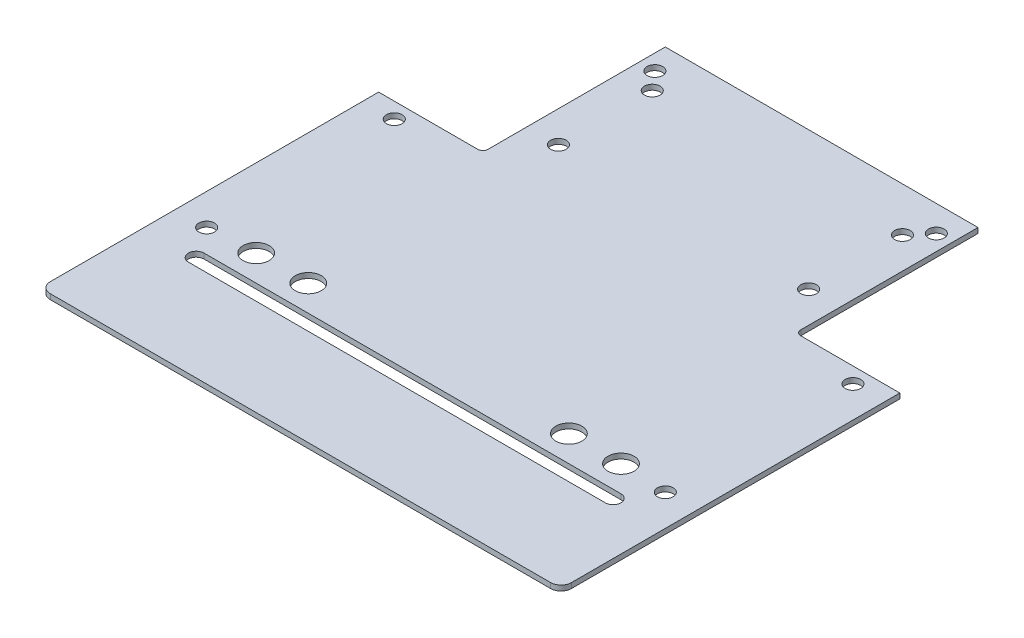
ISO-10303-21;
HEADER;
FILE_DESCRIPTION(('STEP AP214'),'2;1');
FILE_NAME('part.step','',(''),(''),'','','');
FILE_SCHEMA(('AUTOMOTIVE_DESIGN { 1 0 10303 214 1 1 1 1 }'));
ENDSEC;
DATA;
#1=APPLICATION_CONTEXT('core data for automotive mechanical design processes');
#2=APPLICATION_PROTOCOL_DEFINITION('international standard','automotive_design',2000,#1);
#3=PRODUCT_CONTEXT('',#1,'mechanical');
#4=PRODUCT('Part','Part','',(#3));
#5=PRODUCT_RELATED_PRODUCT_CATEGORY('part','',(#4));
#6=PRODUCT_DEFINITION_FORMATION('','',#4);
#7=PRODUCT_DEFINITION_CONTEXT('part definition',#1,'design');
#8=PRODUCT_DEFINITION('design','',#6,#7);
#9=PRODUCT_DEFINITION_SHAPE('','',#8);
#10=(LENGTH_UNIT() NAMED_UNIT(*) SI_UNIT(.MILLI.,.METRE.));
#11=(NAMED_UNIT(*) PLANE_ANGLE_UNIT() SI_UNIT($,.RADIAN.));
#12=(NAMED_UNIT(*) SI_UNIT($,.STERADIAN.) SOLID_ANGLE_UNIT());
#13=UNCERTAINTY_MEASURE_WITH_UNIT(LENGTH_MEASURE(1.E-05),#10,'distance_accuracy_value','');
#14=(GEOMETRIC_REPRESENTATION_CONTEXT(3) GLOBAL_UNCERTAINTY_ASSIGNED_CONTEXT((#13)) GLOBAL_UNIT_ASSIGNED_CONTEXT((#10,
#11,#12)) REPRESENTATION_CONTEXT('',''));
#15=CARTESIAN_POINT('',(0.,0.,0.));
#16=DIRECTION('',(0.,0.,1.));
#17=DIRECTION('',(1.,0.,0.));
#18=AXIS2_PLACEMENT_3D('',#15,#16,#17);
#19=CARTESIAN_POINT('',(2.,1.,-2.));
#20=DIRECTION('',(0.,-1.,0.));
#21=DIRECTION('',(0.,0.,-1.));
#22=AXIS2_PLACEMENT_3D('',#19,#20,#21);
#23=PLANE('',#22);
#24=CARTESIAN_POINT('',(23.,1.,-95.));
#25=DIRECTION('',(0.,1.,0.));
#26=DIRECTION('',(0.,0.,1.));
#27=AXIS2_PLACEMENT_3D('',#24,#25,#26);
#28=CIRCLE('',#27,1.5);
#29=CARTESIAN_POINT('',(23.,1.,-93.5));
#30=VERTEX_POINT('',#29);
#31=EDGE_CURVE('E448',#30,#30,#28,.T.);
#32=ORIENTED_EDGE('',*,*,#31,.F.);
#33=EDGE_LOOP('',(#32));
#34=FACE_BOUND('',#33,.T.);
#35=CARTESIAN_POINT('',(77.,1.,-95.));
#36=DIRECTION('',(0.,1.,0.));
#37=DIRECTION('',(0.,0.,1.));
#38=AXIS2_PLACEMENT_3D('',#35,#36,#37);
#39=CIRCLE('',#38,1.5);
#40=CARTESIAN_POINT('',(77.,1.,-93.5));
#41=VERTEX_POINT('',#40);
#42=EDGE_CURVE('E440',#41,#41,#39,.T.);
#43=ORIENTED_EDGE('',*,*,#42,.F.);
#44=EDGE_LOOP('',(#43));
#45=FACE_BOUND('',#44,.T.);
#46=CARTESIAN_POINT('',(94.,1.,-26.));
#47=DIRECTION('',(0.,1.,0.));
#48=DIRECTION('',(0.,0.,1.));
#49=AXIS2_PLACEMENT_3D('',#46,#47,#48);
#50=CIRCLE('',#49,1.5);
#51=CARTESIAN_POINT('',(94.,1.,-24.5));
#52=VERTEX_POINT('',#51);
#53=EDGE_CURVE('E432',#52,#52,#50,.T.);
#54=ORIENTED_EDGE('',*,*,#53,.F.);
#55=EDGE_LOOP('',(#54));
#56=FACE_BOUND('',#55,.T.);
#57=CARTESIAN_POINT('',(6.,1.,-62.));
#58=DIRECTION('',(0.,1.,0.));
#59=DIRECTION('',(0.,0.,1.));
#60=AXIS2_PLACEMENT_3D('',#57,#58,#59);
#61=CIRCLE('',#60,1.5);
#62=CARTESIAN_POINT('',(6.,1.,-60.5));
#63=VERTEX_POINT('',#62);
#64=EDGE_CURVE('E423',#63,#63,#61,.T.);
#65=ORIENTED_EDGE('',*,*,#64,.F.);
#66=EDGE_LOOP('',(#65));
#67=FACE_BOUND('',#66,.T.);
#68=CARTESIAN_POINT('',(94.,1.,-62.));
#69=DIRECTION('',(0.,1.,0.));
#70=DIRECTION('',(0.,0.,1.));
#71=AXIS2_PLACEMENT_3D('',#68,#69,#70);
#72=CIRCLE('',#71,1.5);
#73=CARTESIAN_POINT('',(94.,1.,-60.5));
#74=VERTEX_POINT('',#73);
#75=EDGE_CURVE('E455',#74,#74,#72,.T.);
#76=ORIENTED_EDGE('',*,*,#75,.F.);
#77=EDGE_LOOP('',(#76));
#78=FACE_BOUND('',#77,.T.);
#79=CARTESIAN_POINT('',(6.00000000000001,1.,-26.));
#80=DIRECTION('',(0.,1.,0.));
#81=DIRECTION('',(0.,0.,1.));
#82=AXIS2_PLACEMENT_3D('',#79,#80,#81);
#83=CIRCLE('',#82,1.5);
#84=CARTESIAN_POINT('',(6.00000000000001,1.,-24.5));
#85=VERTEX_POINT('',#84);
#86=EDGE_CURVE('E415',#85,#85,#83,.T.);
#87=ORIENTED_EDGE('',*,*,#86,.F.);
#88=EDGE_LOOP('',(#87));
#89=FACE_BOUND('',#88,.T.);
#90=CARTESIAN_POINT('',(75.,1.,-26.5));
#91=DIRECTION('',(0.,-1.,0.));
#92=DIRECTION('',(0.,0.,-1.));
#93=AXIS2_PLACEMENT_3D('',#90,#91,#92);
#94=CIRCLE('',#93,2.5);
#95=CARTESIAN_POINT('',(75.,1.,-29.));
#96=VERTEX_POINT('',#95);
#97=EDGE_CURVE('E166',#96,#96,#94,.T.);
#98=ORIENTED_EDGE('',*,*,#97,.T.);
#99=EDGE_LOOP('',(#98));
#100=FACE_BOUND('',#99,.T.);
#101=CARTESIAN_POINT('',(15.,1.,-26.5));
#102=DIRECTION('',(0.,1.,0.));
#103=DIRECTION('',(0.,0.,1.));
#104=AXIS2_PLACEMENT_3D('',#101,#102,#103);
#105=CIRCLE('',#104,2.5);
#106=CARTESIAN_POINT('',(15.,1.,-24.));
#107=VERTEX_POINT('',#106);
#108=EDGE_CURVE('E395',#107,#107,#105,.T.);
#109=ORIENTED_EDGE('',*,*,#108,.F.);
#110=EDGE_LOOP('',(#109));
#111=FACE_BOUND('',#110,.T.);
#112=CARTESIAN_POINT('',(74.,1.,-73.5));
#113=DIRECTION('',(0.,1.,0.));
#114=DIRECTION('',(0.,0.,1.));
#115=AXIS2_PLACEMENT_3D('',#112,#113,#114);
#116=CIRCLE('',#115,1.50000000000001);
#117=CARTESIAN_POINT('',(74.,1.,-72.));
#118=VERTEX_POINT('',#117);
#119=EDGE_CURVE('E207',#118,#118,#116,.T.);
#120=ORIENTED_EDGE('',*,*,#119,.F.);
#121=EDGE_LOOP('',(#120));
#122=FACE_BOUND('',#121,.T.);
#123=CARTESIAN_POINT('',(26.,1.,-73.5));
#124=DIRECTION('',(0.,-1.,0.));
#125=DIRECTION('',(0.,0.,-1.));
#126=AXIS2_PLACEMENT_3D('',#123,#124,#125);
#127=CIRCLE('',#126,1.5);
#128=CARTESIAN_POINT('',(26.,1.,-75.));
#129=VERTEX_POINT('',#128);
#130=EDGE_CURVE('E396',#129,#129,#127,.T.);
#131=ORIENTED_EDGE('',*,*,#130,.T.);
#132=EDGE_LOOP('',(#131));
#133=FACE_BOUND('',#132,.T.);
#134=CARTESIAN_POINT('',(85.,1.,-26.5));
#135=DIRECTION('',(0.,1.,0.));
#136=DIRECTION('',(0.,0.,1.));
#137=AXIS2_PLACEMENT_3D('',#134,#135,#136);
#138=CIRCLE('',#137,2.50000000000001);
#139=CARTESIAN_POINT('',(85.,1.,-24.));
#140=VERTEX_POINT('',#139);
#141=EDGE_CURVE('E247',#140,#140,#138,.F.);
#142=ORIENTED_EDGE('',*,*,#141,.T.);
#143=EDGE_LOOP('',(#142));
#144=FACE_BOUND('',#143,.T.);
#145=CARTESIAN_POINT('',(10.,1.,-20.));
#146=DIRECTION('',(0.,1.,0.));
#147=DIRECTION('',(0.,0.,1.));
#148=AXIS2_PLACEMENT_3D('',#145,#146,#147);
#149=CIRCLE('',#148,1.5);
#150=CARTESIAN_POINT('',(10.,1.,-21.5));
#151=VERTEX_POINT('',#150);
#152=CARTESIAN_POINT('',(10.,1.,-18.5));
#153=VERTEX_POINT('',#152);
#154=EDGE_CURVE('E267',#151,#153,#149,.T.);
#155=ORIENTED_EDGE('',*,*,#154,.F.);
#156=DIRECTION('',(-1.,0.,0.));
#157=VECTOR('',#156,1.);
#158=CARTESIAN_POINT('',(10.,1.,-21.5));
#159=LINE('',#158,#157);
#160=CARTESIAN_POINT('',(90.,1.,-21.5));
#161=VERTEX_POINT('',#160);
#162=EDGE_CURVE('E278',#161,#151,#159,.T.);
#163=ORIENTED_EDGE('',*,*,#162,.F.);
#164=CARTESIAN_POINT('',(90.,1.,-20.));
#165=DIRECTION('',(0.,1.,0.));
#166=DIRECTION('',(0.,0.,1.));
#167=AXIS2_PLACEMENT_3D('',#164,#165,#166);
#168=CIRCLE('',#167,1.5);
#169=CARTESIAN_POINT('',(90.,1.,-18.5));
#170=VERTEX_POINT('',#169);
#171=EDGE_CURVE('E274',#170,#161,#168,.T.);
#172=ORIENTED_EDGE('',*,*,#171,.F.);
#173=DIRECTION('',(1.,0.,0.));
#174=VECTOR('',#173,1.);
#175=CARTESIAN_POINT('',(10.,1.,-18.5));
#176=LINE('',#175,#174);
#177=EDGE_CURVE('E270',#153,#170,#176,.T.);
#178=ORIENTED_EDGE('',*,*,#177,.F.);
#179=EDGE_LOOP('',(#155,#163,#172,#178));
#180=FACE_BOUND('',#179,.T.);
#181=CARTESIAN_POINT('',(74.,1.,-91.5));
#182=DIRECTION('',(0.,1.,0.));
#183=DIRECTION('',(0.,0.,1.));
#184=AXIS2_PLACEMENT_3D('',#181,#182,#183);
#185=CIRCLE('',#184,1.50000000000001);
#186=CARTESIAN_POINT('',(74.,1.,-90.));
#187=VERTEX_POINT('',#186);
#188=EDGE_CURVE('E252',#187,#187,#185,.F.);
#189=ORIENTED_EDGE('',*,*,#188,.T.);
#190=EDGE_LOOP('',(#189));
#191=FACE_BOUND('',#190,.T.);
#192=CARTESIAN_POINT('',(26.,1.,-91.5));
#193=DIRECTION('',(0.,1.,0.));
#194=DIRECTION('',(0.,0.,1.));
#195=AXIS2_PLACEMENT_3D('',#192,#193,#194);
#196=CIRCLE('',#195,1.5);
#197=CARTESIAN_POINT('',(26.,1.,-90.));
#198=VERTEX_POINT('',#197);
#199=EDGE_CURVE('E243',#198,#198,#196,.T.);
#200=ORIENTED_EDGE('',*,*,#199,.F.);
#201=EDGE_LOOP('',(#200));
#202=FACE_BOUND('',#201,.T.);
#203=CARTESIAN_POINT('',(25.,1.,-26.5));
#204=DIRECTION('',(0.,1.,0.));
#205=DIRECTION('',(0.,0.,1.));
#206=AXIS2_PLACEMENT_3D('',#203,#204,#205);
#207=CIRCLE('',#206,2.5);
#208=CARTESIAN_POINT('',(25.,1.,-24.));
#209=VERTEX_POINT('',#208);
#210=EDGE_CURVE('E206',#209,#209,#207,.T.);
#211=ORIENTED_EDGE('',*,*,#210,.F.);
#212=EDGE_LOOP('',(#211));
#213=FACE_BOUND('',#212,.T.);
#214=DIRECTION('',(-1.,0.,0.));
#215=VECTOR('',#214,1.);
#216=CARTESIAN_POINT('',(2.00000000000001,1.,-100.));
#217=LINE('',#216,#215);
#218=CARTESIAN_POINT('',(80.,1.,-100.));
#219=VERTEX_POINT('',#218);
#220=CARTESIAN_POINT('',(20.,1.,-100.));
#221=VERTEX_POINT('',#220);
#222=EDGE_CURVE('E180',#219,#221,#217,.T.);
#223=ORIENTED_EDGE('',*,*,#222,.T.);
#224=DIRECTION('',(0.,0.,-1.));
#225=VECTOR('',#224,1.);
#226=CARTESIAN_POINT('',(20.,1.,0.));
#227=LINE('',#226,#225);
#228=CARTESIAN_POINT('',(20.,1.,-66.));
#229=VERTEX_POINT('',#228);
#230=EDGE_CURVE('E157',#229,#221,#227,.T.);
#231=ORIENTED_EDGE('',*,*,#230,.F.);
#232=CARTESIAN_POINT('',(19.,1.,-66.));
#233=DIRECTION('',(0.,1.,0.));
#234=DIRECTION('',(0.,0.,1.));
#235=AXIS2_PLACEMENT_3D('',#232,#233,#234);
#236=CIRCLE('',#235,1.);
#237=CARTESIAN_POINT('',(19.,1.,-65.));
#238=VERTEX_POINT('',#237);
#239=EDGE_CURVE('E169',#238,#229,#236,.T.);
#240=ORIENTED_EDGE('',*,*,#239,.F.);
#241=DIRECTION('',(1.,0.,0.));
#242=VECTOR('',#241,1.);
#243=CARTESIAN_POINT('',(0.,1.,-65.));
#244=LINE('',#243,#242);
#245=CARTESIAN_POINT('',(0.,1.,-65.));
#246=VERTEX_POINT('',#245);
#247=EDGE_CURVE('E175',#246,#238,#244,.T.);
#248=ORIENTED_EDGE('',*,*,#247,.F.);
#249=DIRECTION('',(0.,0.,1.));
#250=VECTOR('',#249,1.);
#251=CARTESIAN_POINT('',(0.,1.,-2.00000000000001));
#252=LINE('',#251,#250);
#253=CARTESIAN_POINT('',(0.,1.,-2.00000000000001));
#254=VERTEX_POINT('',#253);
#255=EDGE_CURVE('E327',#246,#254,#252,.T.);
#256=ORIENTED_EDGE('',*,*,#255,.T.);
#257=CARTESIAN_POINT('',(2.,1.,-2.));
#258=DIRECTION('',(0.,1.,0.));
#259=DIRECTION('',(0.,0.,-1.));
#260=AXIS2_PLACEMENT_3D('',#257,#258,#259);
#261=CIRCLE('',#260,2.);
#262=CARTESIAN_POINT('',(2.00000000000001,1.,0.));
#263=VERTEX_POINT('',#262);
#264=EDGE_CURVE('E310',#254,#263,#261,.T.);
#265=ORIENTED_EDGE('',*,*,#264,.T.);
#266=DIRECTION('',(1.,0.,0.));
#267=VECTOR('',#266,1.);
#268=CARTESIAN_POINT('',(2.00000000000001,1.,0.));
#269=LINE('',#268,#267);
#270=CARTESIAN_POINT('',(98.,1.,0.));
#271=VERTEX_POINT('',#270);
#272=EDGE_CURVE('E314',#263,#271,#269,.T.);
#273=ORIENTED_EDGE('',*,*,#272,.T.);
#274=CARTESIAN_POINT('',(98.,1.,-2.));
#275=DIRECTION('',(0.,1.,0.));
#276=DIRECTION('',(0.,0.,1.));
#277=AXIS2_PLACEMENT_3D('',#274,#275,#276);
#278=CIRCLE('',#277,2.);
#279=CARTESIAN_POINT('',(100.,1.,-2.00000000000001));
#280=VERTEX_POINT('',#279);
#281=EDGE_CURVE('E318',#271,#280,#278,.T.);
#282=ORIENTED_EDGE('',*,*,#281,.T.);
#283=DIRECTION('',(0.,0.,-1.));
#284=VECTOR('',#283,1.);
#285=CARTESIAN_POINT('',(100.,1.,-2.00000000000001));
#286=LINE('',#285,#284);
#287=CARTESIAN_POINT('',(100.,1.,-65.));
#288=VERTEX_POINT('',#287);
#289=EDGE_CURVE('E321',#280,#288,#286,.T.);
#290=ORIENTED_EDGE('',*,*,#289,.T.);
#291=DIRECTION('',(-1.,0.,0.));
#292=VECTOR('',#291,1.);
#293=CARTESIAN_POINT('',(0.,1.,-65.));
#294=LINE('',#293,#292);
#295=CARTESIAN_POINT('',(81.,1.,-65.));
#296=VERTEX_POINT('',#295);
#297=EDGE_CURVE('E226',#288,#296,#294,.T.);
#298=ORIENTED_EDGE('',*,*,#297,.T.);
#299=CARTESIAN_POINT('',(81.,1.,-66.));
#300=DIRECTION('',(0.,1.,0.));
#301=DIRECTION('',(0.,0.,1.));
#302=AXIS2_PLACEMENT_3D('',#299,#300,#301);
#303=CIRCLE('',#302,1.);
#304=CARTESIAN_POINT('',(80.,1.,-66.));
#305=VERTEX_POINT('',#304);
#306=EDGE_CURVE('E230',#296,#305,#303,.F.);
#307=ORIENTED_EDGE('',*,*,#306,.T.);
#308=DIRECTION('',(0.,0.,-1.));
#309=VECTOR('',#308,1.);
#310=CARTESIAN_POINT('',(80.,1.,0.));
#311=LINE('',#310,#309);
#312=EDGE_CURVE('E216',#305,#219,#311,.T.);
#313=ORIENTED_EDGE('',*,*,#312,.T.);
#314=EDGE_LOOP('',(#223,#231,#240,#248,#256,#265,#273,#282,#290,#298,#307,#313));
#315=FACE_BOUND('',#314,.T.);
#316=ADVANCED_FACE('F39',(#34,#45,#56,#67,#78,#89,#100,#111,#122,#133,#144,#180,#191,#202,#213,
#315),#23,.F.);
#317=CARTESIAN_POINT('',(2.,0.,-2.));
#318=DIRECTION('',(0.,-1.,0.));
#319=DIRECTION('',(0.,0.,-1.));
#320=AXIS2_PLACEMENT_3D('',#317,#318,#319);
#321=PLANE('',#320);
#322=CARTESIAN_POINT('',(23.,0.,-95.));
#323=DIRECTION('',(0.,1.,0.));
#324=DIRECTION('',(0.,0.,1.));
#325=AXIS2_PLACEMENT_3D('',#322,#323,#324);
#326=CIRCLE('',#325,1.5);
#327=CARTESIAN_POINT('',(23.,0.,-93.5));
#328=VERTEX_POINT('',#327);
#329=EDGE_CURVE('E419',#328,#328,#326,.T.);
#330=ORIENTED_EDGE('',*,*,#329,.T.);
#331=EDGE_LOOP('',(#330));
#332=FACE_BOUND('',#331,.T.);
#333=CARTESIAN_POINT('',(77.,0.,-95.));
#334=DIRECTION('',(0.,1.,0.));
#335=DIRECTION('',(0.,0.,1.));
#336=AXIS2_PLACEMENT_3D('',#333,#334,#335);
#337=CIRCLE('',#336,1.5);
#338=CARTESIAN_POINT('',(77.,0.,-93.5));
#339=VERTEX_POINT('',#338);
#340=EDGE_CURVE('E444',#339,#339,#337,.T.);
#341=ORIENTED_EDGE('',*,*,#340,.T.);
#342=EDGE_LOOP('',(#341));
#343=FACE_BOUND('',#342,.T.);
#344=CARTESIAN_POINT('',(94.,0.,-26.));
#345=DIRECTION('',(0.,1.,0.));
#346=DIRECTION('',(0.,0.,1.));
#347=AXIS2_PLACEMENT_3D('',#344,#345,#346);
#348=CIRCLE('',#347,1.5);
#349=CARTESIAN_POINT('',(94.,0.,-24.5));
#350=VERTEX_POINT('',#349);
#351=EDGE_CURVE('E436',#350,#350,#348,.T.);
#352=ORIENTED_EDGE('',*,*,#351,.T.);
#353=EDGE_LOOP('',(#352));
#354=FACE_BOUND('',#353,.T.);
#355=CARTESIAN_POINT('',(6.,0.,-62.));
#356=DIRECTION('',(0.,1.,0.));
#357=DIRECTION('',(0.,0.,1.));
#358=AXIS2_PLACEMENT_3D('',#355,#356,#357);
#359=CIRCLE('',#358,1.5);
#360=CARTESIAN_POINT('',(6.,0.,-60.5));
#361=VERTEX_POINT('',#360);
#362=EDGE_CURVE('E427',#361,#361,#359,.T.);
#363=ORIENTED_EDGE('',*,*,#362,.T.);
#364=EDGE_LOOP('',(#363));
#365=FACE_BOUND('',#364,.T.);
#366=CARTESIAN_POINT('',(94.,0.,-62.));
#367=DIRECTION('',(0.,1.,0.));
#368=DIRECTION('',(0.,0.,1.));
#369=AXIS2_PLACEMENT_3D('',#366,#367,#368);
#370=CIRCLE('',#369,1.5);
#371=CARTESIAN_POINT('',(94.,0.,-60.5));
#372=VERTEX_POINT('',#371);
#373=EDGE_CURVE('E428',#372,#372,#370,.T.);
#374=ORIENTED_EDGE('',*,*,#373,.T.);
#375=EDGE_LOOP('',(#374));
#376=FACE_BOUND('',#375,.T.);
#377=CARTESIAN_POINT('',(6.00000000000001,0.,-26.));
#378=DIRECTION('',(0.,1.,0.));
#379=DIRECTION('',(0.,0.,1.));
#380=AXIS2_PLACEMENT_3D('',#377,#378,#379);
#381=CIRCLE('',#380,1.5);
#382=CARTESIAN_POINT('',(6.00000000000001,0.,-24.5));
#383=VERTEX_POINT('',#382);
#384=EDGE_CURVE('E411',#383,#383,#381,.T.);
#385=ORIENTED_EDGE('',*,*,#384,.T.);
#386=EDGE_LOOP('',(#385));
#387=FACE_BOUND('',#386,.T.);
#388=CARTESIAN_POINT('',(25.,0.,-26.5));
#389=DIRECTION('',(0.,1.,0.));
#390=DIRECTION('',(0.,0.,1.));
#391=AXIS2_PLACEMENT_3D('',#388,#389,#390);
#392=CIRCLE('',#391,2.5);
#393=CARTESIAN_POINT('',(25.,0.,-24.));
#394=VERTEX_POINT('',#393);
#395=EDGE_CURVE('E400',#394,#394,#392,.T.);
#396=ORIENTED_EDGE('',*,*,#395,.T.);
#397=EDGE_LOOP('',(#396));
#398=FACE_BOUND('',#397,.T.);
#399=CARTESIAN_POINT('',(15.,0.,-26.5));
#400=DIRECTION('',(0.,1.,0.));
#401=DIRECTION('',(0.,0.,1.));
#402=AXIS2_PLACEMENT_3D('',#399,#400,#401);
#403=CIRCLE('',#402,2.5);
#404=CARTESIAN_POINT('',(15.,0.,-24.));
#405=VERTEX_POINT('',#404);
#406=EDGE_CURVE('E391',#405,#405,#403,.T.);
#407=ORIENTED_EDGE('',*,*,#406,.T.);
#408=EDGE_LOOP('',(#407));
#409=FACE_BOUND('',#408,.T.);
#410=CARTESIAN_POINT('',(26.,0.,-91.5));
#411=DIRECTION('',(0.,1.,0.));
#412=DIRECTION('',(0.,0.,1.));
#413=AXIS2_PLACEMENT_3D('',#410,#411,#412);
#414=CIRCLE('',#413,1.5);
#415=CARTESIAN_POINT('',(26.,0.,-90.));
#416=VERTEX_POINT('',#415);
#417=EDGE_CURVE('E248',#416,#416,#414,.T.);
#418=ORIENTED_EDGE('',*,*,#417,.T.);
#419=EDGE_LOOP('',(#418));
#420=FACE_BOUND('',#419,.T.);
#421=CARTESIAN_POINT('',(74.,0.,-73.5));
#422=DIRECTION('',(0.,1.,0.));
#423=DIRECTION('',(0.,0.,1.));
#424=AXIS2_PLACEMENT_3D('',#421,#422,#423);
#425=CIRCLE('',#424,1.50000000000001);
#426=CARTESIAN_POINT('',(74.,0.,-72.));
#427=VERTEX_POINT('',#426);
#428=EDGE_CURVE('E212',#427,#427,#425,.T.);
#429=ORIENTED_EDGE('',*,*,#428,.T.);
#430=EDGE_LOOP('',(#429));
#431=FACE_BOUND('',#430,.T.);
#432=DIRECTION('',(-1.,0.,0.));
#433=VECTOR('',#432,1.);
#434=CARTESIAN_POINT('',(10.,0.,-21.5));
#435=LINE('',#434,#433);
#436=CARTESIAN_POINT('',(90.,0.,-21.5));
#437=VERTEX_POINT('',#436);
#438=CARTESIAN_POINT('',(10.,0.,-21.5));
#439=VERTEX_POINT('',#438);
#440=EDGE_CURVE('E271',#437,#439,#435,.T.);
#441=ORIENTED_EDGE('',*,*,#440,.T.);
#442=CARTESIAN_POINT('',(10.,0.,-20.));
#443=DIRECTION('',(0.,1.,0.));
#444=DIRECTION('',(0.,0.,1.));
#445=AXIS2_PLACEMENT_3D('',#442,#443,#444);
#446=CIRCLE('',#445,1.5);
#447=CARTESIAN_POINT('',(10.,0.,-18.5));
#448=VERTEX_POINT('',#447);
#449=EDGE_CURVE('E263',#439,#448,#446,.T.);
#450=ORIENTED_EDGE('',*,*,#449,.T.);
#451=DIRECTION('',(1.,0.,0.));
#452=VECTOR('',#451,1.);
#453=CARTESIAN_POINT('',(10.,0.,-18.5));
#454=LINE('',#453,#452);
#455=CARTESIAN_POINT('',(90.,0.,-18.5));
#456=VERTEX_POINT('',#455);
#457=EDGE_CURVE('E285',#448,#456,#454,.T.);
#458=ORIENTED_EDGE('',*,*,#457,.T.);
#459=CARTESIAN_POINT('',(90.,0.,-20.));
#460=DIRECTION('',(0.,1.,0.));
#461=DIRECTION('',(0.,0.,1.));
#462=AXIS2_PLACEMENT_3D('',#459,#460,#461);
#463=CIRCLE('',#462,1.5);
#464=EDGE_CURVE('E289',#456,#437,#463,.T.);
#465=ORIENTED_EDGE('',*,*,#464,.T.);
#466=EDGE_LOOP('',(#441,#450,#458,#465));
#467=FACE_BOUND('',#466,.T.);
#468=CARTESIAN_POINT('',(85.,0.,-26.5));
#469=DIRECTION('',(0.,1.,0.));
#470=DIRECTION('',(0.,0.,1.));
#471=AXIS2_PLACEMENT_3D('',#468,#469,#470);
#472=CIRCLE('',#471,2.50000000000001);
#473=CARTESIAN_POINT('',(85.,0.,-24.));
#474=VERTEX_POINT('',#473);
#475=EDGE_CURVE('E259',#474,#474,#472,.F.);
#476=ORIENTED_EDGE('',*,*,#475,.F.);
#477=EDGE_LOOP('',(#476));
#478=FACE_BOUND('',#477,.T.);
#479=CARTESIAN_POINT('',(26.,0.,-73.5));
#480=DIRECTION('',(0.,-1.,0.));
#481=DIRECTION('',(0.,0.,-1.));
#482=AXIS2_PLACEMENT_3D('',#479,#480,#481);
#483=CIRCLE('',#482,1.5);
#484=CARTESIAN_POINT('',(26.,0.,-75.));
#485=VERTEX_POINT('',#484);
#486=EDGE_CURVE('E407',#485,#485,#483,.T.);
#487=ORIENTED_EDGE('',*,*,#486,.F.);
#488=EDGE_LOOP('',(#487));
#489=FACE_BOUND('',#488,.T.);
#490=CARTESIAN_POINT('',(74.,0.,-91.5));
#491=DIRECTION('',(0.,1.,0.));
#492=DIRECTION('',(0.,0.,1.));
#493=AXIS2_PLACEMENT_3D('',#490,#491,#492);
#494=CIRCLE('',#493,1.50000000000001);
#495=CARTESIAN_POINT('',(74.,0.,-90.));
#496=VERTEX_POINT('',#495);
#497=EDGE_CURVE('E211',#496,#496,#494,.F.);
#498=ORIENTED_EDGE('',*,*,#497,.F.);
#499=EDGE_LOOP('',(#498));
#500=FACE_BOUND('',#499,.T.);
#501=CARTESIAN_POINT('',(75.,0.,-26.5));
#502=DIRECTION('',(0.,-1.,0.));
#503=DIRECTION('',(0.,0.,-1.));
#504=AXIS2_PLACEMENT_3D('',#501,#502,#503);
#505=CIRCLE('',#504,2.5);
#506=CARTESIAN_POINT('',(75.,0.,-29.));
#507=VERTEX_POINT('',#506);
#508=EDGE_CURVE('E202',#507,#507,#505,.T.);
#509=ORIENTED_EDGE('',*,*,#508,.F.);
#510=EDGE_LOOP('',(#509));
#511=FACE_BOUND('',#510,.T.);
#512=DIRECTION('',(0.,0.,-1.));
#513=VECTOR('',#512,1.);
#514=CARTESIAN_POINT('',(20.,0.,0.));
#515=LINE('',#514,#513);
#516=CARTESIAN_POINT('',(20.,0.,-66.));
#517=VERTEX_POINT('',#516);
#518=CARTESIAN_POINT('',(20.,0.,-100.));
#519=VERTEX_POINT('',#518);
#520=EDGE_CURVE('E160',#517,#519,#515,.T.);
#521=ORIENTED_EDGE('',*,*,#520,.T.);
#522=DIRECTION('',(-1.,0.,0.));
#523=VECTOR('',#522,1.);
#524=CARTESIAN_POINT('',(2.00000000000001,0.,-100.));
#525=LINE('',#524,#523);
#526=CARTESIAN_POINT('',(80.,0.,-100.));
#527=VERTEX_POINT('',#526);
#528=EDGE_CURVE('E344',#527,#519,#525,.T.);
#529=ORIENTED_EDGE('',*,*,#528,.F.);
#530=DIRECTION('',(0.,0.,-1.));
#531=VECTOR('',#530,1.);
#532=CARTESIAN_POINT('',(80.,0.,0.));
#533=LINE('',#532,#531);
#534=CARTESIAN_POINT('',(80.,0.,-66.));
#535=VERTEX_POINT('',#534);
#536=EDGE_CURVE('E55',#535,#527,#533,.T.);
#537=ORIENTED_EDGE('',*,*,#536,.F.);
#538=CARTESIAN_POINT('',(81.,0.,-66.));
#539=DIRECTION('',(0.,1.,0.));
#540=DIRECTION('',(0.,0.,1.));
#541=AXIS2_PLACEMENT_3D('',#538,#539,#540);
#542=CIRCLE('',#541,1.);
#543=CARTESIAN_POINT('',(81.,0.,-65.));
#544=VERTEX_POINT('',#543);
#545=EDGE_CURVE('E238',#544,#535,#542,.F.);
#546=ORIENTED_EDGE('',*,*,#545,.F.);
#547=DIRECTION('',(-1.,0.,0.));
#548=VECTOR('',#547,1.);
#549=CARTESIAN_POINT('',(0.,0.,-65.));
#550=LINE('',#549,#548);
#551=CARTESIAN_POINT('',(100.,0.,-65.));
#552=VERTEX_POINT('',#551);
#553=EDGE_CURVE('E220',#552,#544,#550,.T.);
#554=ORIENTED_EDGE('',*,*,#553,.F.);
#555=DIRECTION('',(0.,0.,-1.));
#556=VECTOR('',#555,1.);
#557=CARTESIAN_POINT('',(100.,0.,-2.00000000000001));
#558=LINE('',#557,#556);
#559=CARTESIAN_POINT('',(100.,0.,-2.00000000000001));
#560=VERTEX_POINT('',#559);
#561=EDGE_CURVE('E340',#560,#552,#558,.T.);
#562=ORIENTED_EDGE('',*,*,#561,.F.);
#563=CARTESIAN_POINT('',(98.,0.,-2.));
#564=DIRECTION('',(0.,1.,0.));
#565=DIRECTION('',(0.,0.,1.));
#566=AXIS2_PLACEMENT_3D('',#563,#564,#565);
#567=CIRCLE('',#566,2.);
#568=CARTESIAN_POINT('',(98.,0.,0.));
#569=VERTEX_POINT('',#568);
#570=EDGE_CURVE('E337',#569,#560,#567,.T.);
#571=ORIENTED_EDGE('',*,*,#570,.F.);
#572=DIRECTION('',(1.,0.,0.));
#573=VECTOR('',#572,1.);
#574=CARTESIAN_POINT('',(2.00000000000001,0.,0.));
#575=LINE('',#574,#573);
#576=CARTESIAN_POINT('',(2.00000000000001,0.,0.));
#577=VERTEX_POINT('',#576);
#578=EDGE_CURVE('E334',#577,#569,#575,.T.);
#579=ORIENTED_EDGE('',*,*,#578,.F.);
#580=CARTESIAN_POINT('',(2.,0.,-2.));
#581=DIRECTION('',(0.,1.,0.));
#582=DIRECTION('',(0.,0.,-1.));
#583=AXIS2_PLACEMENT_3D('',#580,#581,#582);
#584=CIRCLE('',#583,2.);
#585=CARTESIAN_POINT('',(0.,0.,-2.00000000000001));
#586=VERTEX_POINT('',#585);
#587=EDGE_CURVE('E309',#586,#577,#584,.T.);
#588=ORIENTED_EDGE('',*,*,#587,.F.);
#589=DIRECTION('',(0.,0.,1.));
#590=VECTOR('',#589,1.);
#591=CARTESIAN_POINT('',(0.,0.,-2.00000000000001));
#592=LINE('',#591,#590);
#593=CARTESIAN_POINT('',(0.,0.,-65.));
#594=VERTEX_POINT('',#593);
#595=EDGE_CURVE('E315',#594,#586,#592,.T.);
#596=ORIENTED_EDGE('',*,*,#595,.F.);
#597=DIRECTION('',(1.,0.,0.));
#598=VECTOR('',#597,1.);
#599=CARTESIAN_POINT('',(0.,0.,-65.));
#600=LINE('',#599,#598);
#601=CARTESIAN_POINT('',(19.,0.,-65.));
#602=VERTEX_POINT('',#601);
#603=EDGE_CURVE('E63',#594,#602,#600,.T.);
#604=ORIENTED_EDGE('',*,*,#603,.T.);
#605=CARTESIAN_POINT('',(19.,0.,-66.));
#606=DIRECTION('',(0.,1.,0.));
#607=DIRECTION('',(0.,0.,1.));
#608=AXIS2_PLACEMENT_3D('',#605,#606,#607);
#609=CIRCLE('',#608,1.);
#610=EDGE_CURVE('E191',#602,#517,#609,.T.);
#611=ORIENTED_EDGE('',*,*,#610,.T.);
#612=EDGE_LOOP('',(#521,#529,#537,#546,#554,#562,#571,#579,#588,#596,#604,#611));
#613=FACE_BOUND('',#612,.T.);
#614=ADVANCED_FACE('F367',(#332,#343,#354,#365,#376,#387,#398,#409,#420,#431,#467,#478,#489,
#500,#511,#613),#321,.T.);
#615=CARTESIAN_POINT('',(100.,1.,-2.00000000000001));
#616=DIRECTION('',(-1.,0.,0.));
#617=DIRECTION('',(0.,0.,1.));
#618=AXIS2_PLACEMENT_3D('',#615,#616,#617);
#619=PLANE('',#618);
#620=DIRECTION('',(0.,1.,0.));
#621=VECTOR('',#620,1.);
#622=CARTESIAN_POINT('',(100.,0.,-65.));
#623=LINE('',#622,#621);
#624=EDGE_CURVE('E182',#552,#288,#623,.T.);
#625=ORIENTED_EDGE('',*,*,#624,.T.);
#626=ORIENTED_EDGE('',*,*,#289,.F.);
#627=DIRECTION('',(0.,-1.,0.));
#628=VECTOR('',#627,1.);
#629=CARTESIAN_POINT('',(100.,1.,-2.00000000000001));
#630=LINE('',#629,#628);
#631=EDGE_CURVE('E353',#280,#560,#630,.T.);
#632=ORIENTED_EDGE('',*,*,#631,.T.);
#633=ORIENTED_EDGE('',*,*,#561,.T.);
#634=EDGE_LOOP('',(#625,#626,#632,#633));
#635=FACE_BOUND('',#634,.T.);
#636=ADVANCED_FACE('F372',(#635),#619,.F.);
#637=CARTESIAN_POINT('',(2.00000000000001,1.,-100.));
#638=DIRECTION('',(0.,0.,1.));
#639=DIRECTION('',(1.,0.,0.));
#640=AXIS2_PLACEMENT_3D('',#637,#638,#639);
#641=PLANE('',#640);
#642=ORIENTED_EDGE('',*,*,#528,.T.);
#643=DIRECTION('',(0.,1.,0.));
#644=VECTOR('',#643,1.);
#645=CARTESIAN_POINT('',(20.,0.,-100.));
#646=LINE('',#645,#644);
#647=EDGE_CURVE('E194',#519,#221,#646,.T.);
#648=ORIENTED_EDGE('',*,*,#647,.T.);
#649=ORIENTED_EDGE('',*,*,#222,.F.);
#650=DIRECTION('',(0.,1.,0.));
#651=VECTOR('',#650,1.);
#652=CARTESIAN_POINT('',(80.,0.,-100.));
#653=LINE('',#652,#651);
#654=EDGE_CURVE('E217',#527,#219,#653,.T.);
#655=ORIENTED_EDGE('',*,*,#654,.F.);
#656=EDGE_LOOP('',(#642,#648,#649,#655));
#657=FACE_BOUND('',#656,.T.);
#658=ADVANCED_FACE('F573',(#657),#641,.F.);
#659=CARTESIAN_POINT('',(2.,1.,-2.));
#660=DIRECTION('',(0.,-1.,0.));
#661=DIRECTION('',(0.,0.,-1.));
#662=AXIS2_PLACEMENT_3D('',#659,#660,#661);
#663=CYLINDRICAL_SURFACE('',#662,2.);
#664=ORIENTED_EDGE('',*,*,#587,.T.);
#665=DIRECTION('',(0.,-1.,0.));
#666=VECTOR('',#665,1.);
#667=CARTESIAN_POINT('',(2.00000000000001,1.,0.));
#668=LINE('',#667,#666);
#669=EDGE_CURVE('E11',#263,#577,#668,.T.);
#670=ORIENTED_EDGE('',*,*,#669,.F.);
#671=ORIENTED_EDGE('',*,*,#264,.F.);
#672=DIRECTION('',(0.,-1.,0.));
#673=VECTOR('',#672,1.);
#674=CARTESIAN_POINT('',(0.,1.,-2.00000000000001));
#675=LINE('',#674,#673);
#676=EDGE_CURVE('E330',#254,#586,#675,.T.);
#677=ORIENTED_EDGE('',*,*,#676,.T.);
#678=EDGE_LOOP('',(#664,#670,#671,#677));
#679=FACE_BOUND('',#678,.T.);
#680=ADVANCED_FACE('F41',(#679),#663,.T.);
#681=CARTESIAN_POINT('',(2.00000000000001,1.,0.));
#682=DIRECTION('',(0.,0.,-1.));
#683=DIRECTION('',(-1.,0.,0.));
#684=AXIS2_PLACEMENT_3D('',#681,#682,#683);
#685=PLANE('',#684);
#686=ORIENTED_EDGE('',*,*,#578,.T.);
#687=DIRECTION('',(0.,-1.,0.));
#688=VECTOR('',#687,1.);
#689=CARTESIAN_POINT('',(98.,1.,0.));
#690=LINE('',#689,#688);
#691=EDGE_CURVE('E48',#271,#569,#690,.T.);
#692=ORIENTED_EDGE('',*,*,#691,.F.);
#693=ORIENTED_EDGE('',*,*,#272,.F.);
#694=ORIENTED_EDGE('',*,*,#669,.T.);
#695=EDGE_LOOP('',(#686,#692,#693,#694));
#696=FACE_BOUND('',#695,.T.);
#697=ADVANCED_FACE('F376',(#696),#685,.F.);
#698=CARTESIAN_POINT('',(98.,1.,-2.));
#699=DIRECTION('',(0.,-1.,0.));
#700=DIRECTION('',(0.,0.,-1.));
#701=AXIS2_PLACEMENT_3D('',#698,#699,#700);
#702=CYLINDRICAL_SURFACE('',#701,2.);
#703=ORIENTED_EDGE('',*,*,#570,.T.);
#704=ORIENTED_EDGE('',*,*,#631,.F.);
#705=ORIENTED_EDGE('',*,*,#281,.F.);
#706=ORIENTED_EDGE('',*,*,#691,.T.);
#707=EDGE_LOOP('',(#703,#704,#705,#706));
#708=FACE_BOUND('',#707,.T.);
#709=ADVANCED_FACE('F362',(#708),#702,.T.);
#710=CARTESIAN_POINT('',(0.,1.,-2.00000000000001));
#711=DIRECTION('',(1.,0.,0.));
#712=DIRECTION('',(0.,0.,-1.));
#713=AXIS2_PLACEMENT_3D('',#710,#711,#712);
#714=PLANE('',#713);
#715=ORIENTED_EDGE('',*,*,#255,.F.);
#716=DIRECTION('',(0.,1.,0.));
#717=VECTOR('',#716,1.);
#718=CARTESIAN_POINT('',(0.,0.,-65.));
#719=LINE('',#718,#717);
#720=EDGE_CURVE('E383',#594,#246,#719,.T.);
#721=ORIENTED_EDGE('',*,*,#720,.F.);
#722=ORIENTED_EDGE('',*,*,#595,.T.);
#723=ORIENTED_EDGE('',*,*,#676,.F.);
#724=EDGE_LOOP('',(#715,#721,#722,#723));
#725=FACE_BOUND('',#724,.T.);
#726=ADVANCED_FACE('F382',(#725),#714,.F.);
#727=CARTESIAN_POINT('',(10.,1.,-20.));
#728=DIRECTION('',(0.,-1.,0.));
#729=DIRECTION('',(0.,0.,-1.));
#730=AXIS2_PLACEMENT_3D('',#727,#728,#729);
#731=CYLINDRICAL_SURFACE('',#730,1.5);
#732=ORIENTED_EDGE('',*,*,#449,.F.);
#733=DIRECTION('',(0.,-1.,0.));
#734=VECTOR('',#733,1.);
#735=CARTESIAN_POINT('',(10.,1.,-21.5));
#736=LINE('',#735,#734);
#737=EDGE_CURVE('E281',#151,#439,#736,.T.);
#738=ORIENTED_EDGE('',*,*,#737,.F.);
#739=ORIENTED_EDGE('',*,*,#154,.T.);
#740=DIRECTION('',(0.,-1.,0.));
#741=VECTOR('',#740,1.);
#742=CARTESIAN_POINT('',(10.,1.,-18.5));
#743=LINE('',#742,#741);
#744=EDGE_CURVE('E305',#153,#448,#743,.T.);
#745=ORIENTED_EDGE('',*,*,#744,.T.);
#746=EDGE_LOOP('',(#732,#738,#739,#745));
#747=FACE_BOUND('',#746,.T.);
#748=ADVANCED_FACE('F563',(#747),#731,.F.);
#749=CARTESIAN_POINT('',(10.,1.,-18.5));
#750=DIRECTION('',(0.,0.,-1.));
#751=DIRECTION('',(-1.,0.,0.));
#752=AXIS2_PLACEMENT_3D('',#749,#750,#751);
#753=PLANE('',#752);
#754=ORIENTED_EDGE('',*,*,#457,.F.);
#755=ORIENTED_EDGE('',*,*,#744,.F.);
#756=ORIENTED_EDGE('',*,*,#177,.T.);
#757=DIRECTION('',(0.,-1.,0.));
#758=VECTOR('',#757,1.);
#759=CARTESIAN_POINT('',(90.,1.,-18.5));
#760=LINE('',#759,#758);
#761=EDGE_CURVE('E302',#170,#456,#760,.T.);
#762=ORIENTED_EDGE('',*,*,#761,.T.);
#763=EDGE_LOOP('',(#754,#755,#756,#762));
#764=FACE_BOUND('',#763,.T.);
#765=ADVANCED_FACE('F559',(#764),#753,.T.);
#766=CARTESIAN_POINT('',(90.,1.,-20.));
#767=DIRECTION('',(0.,-1.,0.));
#768=DIRECTION('',(0.,0.,-1.));
#769=AXIS2_PLACEMENT_3D('',#766,#767,#768);
#770=CYLINDRICAL_SURFACE('',#769,1.5);
#771=ORIENTED_EDGE('',*,*,#464,.F.);
#772=ORIENTED_EDGE('',*,*,#761,.F.);
#773=ORIENTED_EDGE('',*,*,#171,.T.);
#774=DIRECTION('',(0.,-1.,0.));
#775=VECTOR('',#774,1.);
#776=CARTESIAN_POINT('',(90.,1.,-21.5));
#777=LINE('',#776,#775);
#778=EDGE_CURVE('E299',#161,#437,#777,.T.);
#779=ORIENTED_EDGE('',*,*,#778,.T.);
#780=EDGE_LOOP('',(#771,#772,#773,#779));
#781=FACE_BOUND('',#780,.T.);
#782=ADVANCED_FACE('F555',(#781),#770,.F.);
#783=CARTESIAN_POINT('',(10.,1.,-21.5));
#784=DIRECTION('',(0.,0.,1.));
#785=DIRECTION('',(1.,0.,0.));
#786=AXIS2_PLACEMENT_3D('',#783,#784,#785);
#787=PLANE('',#786);
#788=ORIENTED_EDGE('',*,*,#440,.F.);
#789=ORIENTED_EDGE('',*,*,#778,.F.);
#790=ORIENTED_EDGE('',*,*,#162,.T.);
#791=ORIENTED_EDGE('',*,*,#737,.T.);
#792=EDGE_LOOP('',(#788,#789,#790,#791));
#793=FACE_BOUND('',#792,.T.);
#794=ADVANCED_FACE('F521',(#793),#787,.T.);
#795=CARTESIAN_POINT('',(20.,0.,0.));
#796=DIRECTION('',(1.,0.,0.));
#797=DIRECTION('',(0.,0.,-1.));
#798=AXIS2_PLACEMENT_3D('',#795,#796,#797);
#799=PLANE('',#798);
#800=ORIENTED_EDGE('',*,*,#230,.T.);
#801=ORIENTED_EDGE('',*,*,#647,.F.);
#802=ORIENTED_EDGE('',*,*,#520,.F.);
#803=DIRECTION('',(0.,1.,0.));
#804=VECTOR('',#803,1.);
#805=CARTESIAN_POINT('',(20.,0.,-66.));
#806=LINE('',#805,#804);
#807=EDGE_CURVE('E153',#517,#229,#806,.T.);
#808=ORIENTED_EDGE('',*,*,#807,.T.);
#809=EDGE_LOOP('',(#800,#801,#802,#808));
#810=FACE_BOUND('',#809,.T.);
#811=ADVANCED_FACE('F155',(#810),#799,.F.);
#812=CARTESIAN_POINT('',(19.,0.,-66.));
#813=DIRECTION('',(0.,1.,0.));
#814=DIRECTION('',(0.,0.,1.));
#815=AXIS2_PLACEMENT_3D('',#812,#813,#814);
#816=CYLINDRICAL_SURFACE('',#815,1.);
#817=ORIENTED_EDGE('',*,*,#239,.T.);
#818=ORIENTED_EDGE('',*,*,#807,.F.);
#819=ORIENTED_EDGE('',*,*,#610,.F.);
#820=DIRECTION('',(0.,1.,0.));
#821=VECTOR('',#820,1.);
#822=CARTESIAN_POINT('',(19.,0.,-65.));
#823=LINE('',#822,#821);
#824=EDGE_CURVE('E165',#602,#238,#823,.T.);
#825=ORIENTED_EDGE('',*,*,#824,.T.);
#826=EDGE_LOOP('',(#817,#818,#819,#825));
#827=FACE_BOUND('',#826,.T.);
#828=ADVANCED_FACE('F170',(#827),#816,.F.);
#829=CARTESIAN_POINT('',(0.,0.,-65.));
#830=DIRECTION('',(0.,0.,1.));
#831=DIRECTION('',(1.,0.,0.));
#832=AXIS2_PLACEMENT_3D('',#829,#830,#831);
#833=PLANE('',#832);
#834=ORIENTED_EDGE('',*,*,#247,.T.);
#835=ORIENTED_EDGE('',*,*,#824,.F.);
#836=ORIENTED_EDGE('',*,*,#603,.F.);
#837=ORIENTED_EDGE('',*,*,#720,.T.);
#838=EDGE_LOOP('',(#834,#835,#836,#837));
#839=FACE_BOUND('',#838,.T.);
#840=ADVANCED_FACE('F522',(#839),#833,.F.);
#841=CARTESIAN_POINT('',(0.,0.,-65.));
#842=DIRECTION('',(0.,0.,-1.));
#843=DIRECTION('',(-1.,0.,0.));
#844=AXIS2_PLACEMENT_3D('',#841,#842,#843);
#845=PLANE('',#844);
#846=ORIENTED_EDGE('',*,*,#297,.F.);
#847=ORIENTED_EDGE('',*,*,#624,.F.);
#848=ORIENTED_EDGE('',*,*,#553,.T.);
#849=DIRECTION('',(0.,1.,0.));
#850=VECTOR('',#849,1.);
#851=CARTESIAN_POINT('',(81.,0.,-65.));
#852=LINE('',#851,#850);
#853=EDGE_CURVE('E187',#544,#296,#852,.T.);
#854=ORIENTED_EDGE('',*,*,#853,.T.);
#855=EDGE_LOOP('',(#846,#847,#848,#854));
#856=FACE_BOUND('',#855,.T.);
#857=ADVANCED_FACE('F525',(#856),#845,.T.);
#858=CARTESIAN_POINT('',(81.,0.,-66.));
#859=DIRECTION('',(0.,1.,0.));
#860=DIRECTION('',(0.,0.,1.));
#861=AXIS2_PLACEMENT_3D('',#858,#859,#860);
#862=CYLINDRICAL_SURFACE('',#861,1.);
#863=ORIENTED_EDGE('',*,*,#306,.F.);
#864=ORIENTED_EDGE('',*,*,#853,.F.);
#865=ORIENTED_EDGE('',*,*,#545,.T.);
#866=DIRECTION('',(0.,1.,0.));
#867=VECTOR('',#866,1.);
#868=CARTESIAN_POINT('',(80.,0.,-66.));
#869=LINE('',#868,#867);
#870=EDGE_CURVE('E221',#535,#305,#869,.T.);
#871=ORIENTED_EDGE('',*,*,#870,.T.);
#872=EDGE_LOOP('',(#863,#864,#865,#871));
#873=FACE_BOUND('',#872,.T.);
#874=ADVANCED_FACE('F537',(#873),#862,.F.);
#875=CARTESIAN_POINT('',(80.,0.,0.));
#876=DIRECTION('',(1.,0.,0.));
#877=DIRECTION('',(0.,0.,-1.));
#878=AXIS2_PLACEMENT_3D('',#875,#876,#877);
#879=PLANE('',#878);
#880=ORIENTED_EDGE('',*,*,#312,.F.);
#881=ORIENTED_EDGE('',*,*,#870,.F.);
#882=ORIENTED_EDGE('',*,*,#536,.T.);
#883=ORIENTED_EDGE('',*,*,#654,.T.);
#884=EDGE_LOOP('',(#880,#881,#882,#883));
#885=FACE_BOUND('',#884,.T.);
#886=ADVANCED_FACE('F533',(#885),#879,.T.);
#887=CARTESIAN_POINT('',(85.,0.,-26.5));
#888=DIRECTION('',(0.,1.,0.));
#889=DIRECTION('',(0.,0.,1.));
#890=AXIS2_PLACEMENT_3D('',#887,#888,#889);
#891=CYLINDRICAL_SURFACE('',#890,2.50000000000001);
#892=ORIENTED_EDGE('',*,*,#475,.T.);
#893=EDGE_LOOP('',(#892));
#894=FACE_BOUND('',#893,.T.);
#895=ORIENTED_EDGE('',*,*,#141,.F.);
#896=EDGE_LOOP('',(#895));
#897=FACE_BOUND('',#896,.T.);
#898=ADVANCED_FACE('F536',(#894,#897),#891,.F.);
#899=CARTESIAN_POINT('',(26.,0.,-73.5));
#900=DIRECTION('',(0.,1.,0.));
#901=DIRECTION('',(0.,0.,1.));
#902=AXIS2_PLACEMENT_3D('',#899,#900,#901);
#903=CYLINDRICAL_SURFACE('',#902,1.5);
#904=ORIENTED_EDGE('',*,*,#486,.T.);
#905=EDGE_LOOP('',(#904));
#906=FACE_BOUND('',#905,.T.);
#907=ORIENTED_EDGE('',*,*,#130,.F.);
#908=EDGE_LOOP('',(#907));
#909=FACE_BOUND('',#908,.T.);
#910=ADVANCED_FACE('F516',(#906,#909),#903,.F.);
#911=CARTESIAN_POINT('',(74.,0.,-73.5));
#912=DIRECTION('',(0.,1.,0.));
#913=DIRECTION('',(0.,0.,1.));
#914=AXIS2_PLACEMENT_3D('',#911,#912,#913);
#915=CYLINDRICAL_SURFACE('',#914,1.50000000000001);
#916=ORIENTED_EDGE('',*,*,#428,.F.);
#917=EDGE_LOOP('',(#916));
#918=FACE_BOUND('',#917,.T.);
#919=ORIENTED_EDGE('',*,*,#119,.T.);
#920=EDGE_LOOP('',(#919));
#921=FACE_BOUND('',#920,.T.);
#922=ADVANCED_FACE('F528',(#918,#921),#915,.F.);
#923=CARTESIAN_POINT('',(74.,0.,-91.5));
#924=DIRECTION('',(0.,1.,0.));
#925=DIRECTION('',(0.,0.,1.));
#926=AXIS2_PLACEMENT_3D('',#923,#924,#925);
#927=CYLINDRICAL_SURFACE('',#926,1.50000000000001);
#928=ORIENTED_EDGE('',*,*,#497,.T.);
#929=EDGE_LOOP('',(#928));
#930=FACE_BOUND('',#929,.T.);
#931=ORIENTED_EDGE('',*,*,#188,.F.);
#932=EDGE_LOOP('',(#931));
#933=FACE_BOUND('',#932,.T.);
#934=ADVANCED_FACE('F531',(#930,#933),#927,.F.);
#935=CARTESIAN_POINT('',(26.,0.,-91.5));
#936=DIRECTION('',(0.,1.,0.));
#937=DIRECTION('',(0.,0.,1.));
#938=AXIS2_PLACEMENT_3D('',#935,#936,#937);
#939=CYLINDRICAL_SURFACE('',#938,1.5);
#940=ORIENTED_EDGE('',*,*,#417,.F.);
#941=EDGE_LOOP('',(#940));
#942=FACE_BOUND('',#941,.T.);
#943=ORIENTED_EDGE('',*,*,#199,.T.);
#944=EDGE_LOOP('',(#943));
#945=FACE_BOUND('',#944,.T.);
#946=ADVANCED_FACE('F511',(#942,#945),#939,.F.);
#947=CARTESIAN_POINT('',(15.,0.,-26.5));
#948=DIRECTION('',(0.,1.,0.));
#949=DIRECTION('',(0.,0.,1.));
#950=AXIS2_PLACEMENT_3D('',#947,#948,#949);
#951=CYLINDRICAL_SURFACE('',#950,2.5);
#952=ORIENTED_EDGE('',*,*,#406,.F.);
#953=EDGE_LOOP('',(#952));
#954=FACE_BOUND('',#953,.T.);
#955=ORIENTED_EDGE('',*,*,#108,.T.);
#956=EDGE_LOOP('',(#955));
#957=FACE_BOUND('',#956,.T.);
#958=ADVANCED_FACE('F502',(#954,#957),#951,.F.);
#959=CARTESIAN_POINT('',(25.,0.,-26.5));
#960=DIRECTION('',(0.,1.,0.));
#961=DIRECTION('',(0.,0.,1.));
#962=AXIS2_PLACEMENT_3D('',#959,#960,#961);
#963=CYLINDRICAL_SURFACE('',#962,2.5);
#964=ORIENTED_EDGE('',*,*,#395,.F.);
#965=EDGE_LOOP('',(#964));
#966=FACE_BOUND('',#965,.T.);
#967=ORIENTED_EDGE('',*,*,#210,.T.);
#968=EDGE_LOOP('',(#967));
#969=FACE_BOUND('',#968,.T.);
#970=ADVANCED_FACE('F499',(#966,#969),#963,.F.);
#971=CARTESIAN_POINT('',(75.,0.,-26.5));
#972=DIRECTION('',(0.,1.,0.));
#973=DIRECTION('',(0.,0.,1.));
#974=AXIS2_PLACEMENT_3D('',#971,#972,#973);
#975=CYLINDRICAL_SURFACE('',#974,2.5);
#976=ORIENTED_EDGE('',*,*,#508,.T.);
#977=EDGE_LOOP('',(#976));
#978=FACE_BOUND('',#977,.T.);
#979=ORIENTED_EDGE('',*,*,#97,.F.);
#980=EDGE_LOOP('',(#979));
#981=FACE_BOUND('',#980,.T.);
#982=ADVANCED_FACE('F501',(#978,#981),#975,.F.);
#983=CARTESIAN_POINT('',(6.00000000000001,0.,-26.));
#984=DIRECTION('',(0.,1.,0.));
#985=DIRECTION('',(0.,0.,1.));
#986=AXIS2_PLACEMENT_3D('',#983,#984,#985);
#987=CYLINDRICAL_SURFACE('',#986,1.5);
#988=ORIENTED_EDGE('',*,*,#384,.F.);
#989=EDGE_LOOP('',(#988));
#990=FACE_BOUND('',#989,.T.);
#991=ORIENTED_EDGE('',*,*,#86,.T.);
#992=EDGE_LOOP('',(#991));
#993=FACE_BOUND('',#992,.T.);
#994=ADVANCED_FACE('F469',(#990,#993),#987,.F.);
#995=CARTESIAN_POINT('',(94.,0.,-62.));
#996=DIRECTION('',(0.,1.,0.));
#997=DIRECTION('',(0.,0.,1.));
#998=AXIS2_PLACEMENT_3D('',#995,#996,#997);
#999=CYLINDRICAL_SURFACE('',#998,1.5);
#1000=ORIENTED_EDGE('',*,*,#373,.F.);
#1001=EDGE_LOOP('',(#1000));
#1002=FACE_BOUND('',#1001,.T.);
#1003=ORIENTED_EDGE('',*,*,#75,.T.);
#1004=EDGE_LOOP('',(#1003));
#1005=FACE_BOUND('',#1004,.T.);
#1006=ADVANCED_FACE('F465',(#1002,#1005),#999,.F.);
#1007=CARTESIAN_POINT('',(6.,0.,-62.));
#1008=DIRECTION('',(0.,1.,0.));
#1009=DIRECTION('',(0.,0.,1.));
#1010=AXIS2_PLACEMENT_3D('',#1007,#1008,#1009);
#1011=CYLINDRICAL_SURFACE('',#1010,1.5);
#1012=ORIENTED_EDGE('',*,*,#362,.F.);
#1013=EDGE_LOOP('',(#1012));
#1014=FACE_BOUND('',#1013,.T.);
#1015=ORIENTED_EDGE('',*,*,#64,.T.);
#1016=EDGE_LOOP('',(#1015));
#1017=FACE_BOUND('',#1016,.T.);
#1018=ADVANCED_FACE('F468',(#1014,#1017),#1011,.F.);
#1019=CARTESIAN_POINT('',(94.,0.,-26.));
#1020=DIRECTION('',(0.,1.,0.));
#1021=DIRECTION('',(0.,0.,1.));
#1022=AXIS2_PLACEMENT_3D('',#1019,#1020,#1021);
#1023=CYLINDRICAL_SURFACE('',#1022,1.5);
#1024=ORIENTED_EDGE('',*,*,#351,.F.);
#1025=EDGE_LOOP('',(#1024));
#1026=FACE_BOUND('',#1025,.T.);
#1027=ORIENTED_EDGE('',*,*,#53,.T.);
#1028=EDGE_LOOP('',(#1027));
#1029=FACE_BOUND('',#1028,.T.);
#1030=ADVANCED_FACE('F767',(#1026,#1029),#1023,.F.);
#1031=CARTESIAN_POINT('',(77.,0.,-95.));
#1032=DIRECTION('',(0.,1.,0.));
#1033=DIRECTION('',(0.,0.,1.));
#1034=AXIS2_PLACEMENT_3D('',#1031,#1032,#1033);
#1035=CYLINDRICAL_SURFACE('',#1034,1.5);
#1036=ORIENTED_EDGE('',*,*,#340,.F.);
#1037=EDGE_LOOP('',(#1036));
#1038=FACE_BOUND('',#1037,.T.);
#1039=ORIENTED_EDGE('',*,*,#42,.T.);
#1040=EDGE_LOOP('',(#1039));
#1041=FACE_BOUND('',#1040,.T.);
#1042=ADVANCED_FACE('F775',(#1038,#1041),#1035,.F.);
#1043=CARTESIAN_POINT('',(23.,0.,-95.));
#1044=DIRECTION('',(0.,1.,0.));
#1045=DIRECTION('',(0.,0.,1.));
#1046=AXIS2_PLACEMENT_3D('',#1043,#1044,#1045);
#1047=CYLINDRICAL_SURFACE('',#1046,1.5);
#1048=ORIENTED_EDGE('',*,*,#329,.F.);
#1049=EDGE_LOOP('',(#1048));
#1050=FACE_BOUND('',#1049,.T.);
#1051=ORIENTED_EDGE('',*,*,#31,.T.);
#1052=EDGE_LOOP('',(#1051));
#1053=FACE_BOUND('',#1052,.T.);
#1054=ADVANCED_FACE('F783',(#1050,#1053),#1047,.F.);
#1055=CLOSED_SHELL('',(#316,#614,#636,#658,#680,#697,#709,#726,#748,#765,#782,#794,#811,#828,
#840,#857,#874,#886,#898,#910,#922,#934,#946,#958,#970,#982,#994,#1006,#1018,#1030,#1042,#1054));
#1056=MANIFOLD_SOLID_BREP('B2',#1055);
#1057=ADVANCED_BREP_SHAPE_REPRESENTATION('',(#18,#1056),#14);
#1058=SHAPE_DEFINITION_REPRESENTATION(#9,#1057);
ENDSEC;
END-ISO-10303-21;
